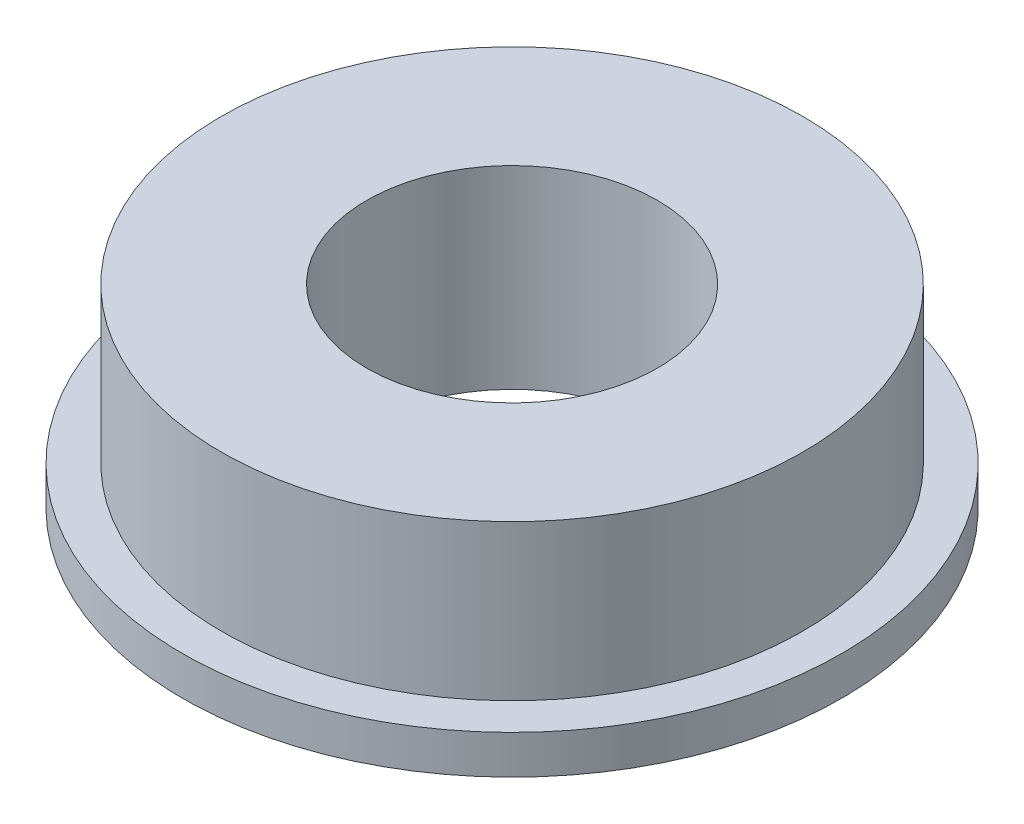
ISO-10303-21;
HEADER;
FILE_DESCRIPTION(('STEP AP214'),'2;1');
FILE_NAME('part.step','',(''),(''),'','','');
FILE_SCHEMA(('AUTOMOTIVE_DESIGN { 1 0 10303 214 1 1 1 1 }'));
ENDSEC;
DATA;
#1=APPLICATION_CONTEXT('core data for automotive mechanical design processes');
#2=APPLICATION_PROTOCOL_DEFINITION('international standard','automotive_design',2000,#1);
#3=PRODUCT_CONTEXT('',#1,'mechanical');
#4=PRODUCT('Part','Part','',(#3));
#5=PRODUCT_RELATED_PRODUCT_CATEGORY('part','',(#4));
#6=PRODUCT_DEFINITION_FORMATION('','',#4);
#7=PRODUCT_DEFINITION_CONTEXT('part definition',#1,'design');
#8=PRODUCT_DEFINITION('design','',#6,#7);
#9=PRODUCT_DEFINITION_SHAPE('','',#8);
#10=(LENGTH_UNIT() NAMED_UNIT(*) SI_UNIT(.MILLI.,.METRE.));
#11=(NAMED_UNIT(*) PLANE_ANGLE_UNIT() SI_UNIT($,.RADIAN.));
#12=(NAMED_UNIT(*) SI_UNIT($,.STERADIAN.) SOLID_ANGLE_UNIT());
#13=UNCERTAINTY_MEASURE_WITH_UNIT(LENGTH_MEASURE(1.E-05),#10,'distance_accuracy_value','');
#14=(GEOMETRIC_REPRESENTATION_CONTEXT(3) GLOBAL_UNCERTAINTY_ASSIGNED_CONTEXT((#13)) GLOBAL_UNIT_ASSIGNED_CONTEXT((#10,
#11,#12)) REPRESENTATION_CONTEXT('',''));
#15=CARTESIAN_POINT('',(0.,0.,0.));
#16=DIRECTION('',(0.,0.,1.));
#17=DIRECTION('',(1.,0.,0.));
#18=AXIS2_PLACEMENT_3D('',#15,#16,#17);
#19=CARTESIAN_POINT('',(0.,0.,0.));
#20=DIRECTION('',(0.,-1.,0.));
#21=DIRECTION('',(0.,0.,-1.));
#22=AXIS2_PLACEMENT_3D('',#19,#20,#21);
#23=CYLINDRICAL_SURFACE('',#22,3.);
#24=CARTESIAN_POINT('',(0.,0.,0.));
#25=DIRECTION('',(0.,-1.,0.));
#26=DIRECTION('',(0.,0.,-1.));
#27=AXIS2_PLACEMENT_3D('',#24,#25,#26);
#28=CIRCLE('',#27,3.);
#29=CARTESIAN_POINT('',(0.,0.,-3.));
#30=VERTEX_POINT('',#29);
#31=EDGE_CURVE('E58',#30,#30,#28,.T.);
#32=ORIENTED_EDGE('',*,*,#31,.T.);
#33=EDGE_LOOP('',(#32));
#34=FACE_BOUND('',#33,.T.);
#35=CARTESIAN_POINT('',(0.,4.,0.));
#36=DIRECTION('',(0.,-1.,0.));
#37=DIRECTION('',(0.,0.,-1.));
#38=AXIS2_PLACEMENT_3D('',#35,#36,#37);
#39=CIRCLE('',#38,3.);
#40=CARTESIAN_POINT('',(0.,4.,-3.));
#41=VERTEX_POINT('',#40);
#42=EDGE_CURVE('E10',#41,#41,#39,.T.);
#43=ORIENTED_EDGE('',*,*,#42,.F.);
#44=EDGE_LOOP('',(#43));
#45=FACE_BOUND('',#44,.T.);
#46=ADVANCED_FACE('F36',(#34,#45),#23,.F.);
#47=CARTESIAN_POINT('',(0.,4.,0.));
#48=DIRECTION('',(0.,1.,0.));
#49=DIRECTION('',(0.,0.,1.));
#50=AXIS2_PLACEMENT_3D('',#47,#48,#49);
#51=PLANE('',#50);
#52=ORIENTED_EDGE('',*,*,#42,.T.);
#53=EDGE_LOOP('',(#52));
#54=FACE_BOUND('',#53,.T.);
#55=CARTESIAN_POINT('',(0.,4.,0.));
#56=DIRECTION('',(0.,-1.,0.));
#57=DIRECTION('',(0.,0.,-1.));
#58=AXIS2_PLACEMENT_3D('',#55,#56,#57);
#59=CIRCLE('',#58,6.);
#60=CARTESIAN_POINT('',(0.,4.,-6.));
#61=VERTEX_POINT('',#60);
#62=EDGE_CURVE('E42',#61,#61,#59,.T.);
#63=ORIENTED_EDGE('',*,*,#62,.F.);
#64=EDGE_LOOP('',(#63));
#65=FACE_BOUND('',#64,.T.);
#66=ADVANCED_FACE('F76',(#54,#65),#51,.T.);
#67=CARTESIAN_POINT('',(0.,0.,0.));
#68=DIRECTION('',(0.,-1.,0.));
#69=DIRECTION('',(0.,0.,-1.));
#70=AXIS2_PLACEMENT_3D('',#67,#68,#69);
#71=CYLINDRICAL_SURFACE('',#70,6.);
#72=ORIENTED_EDGE('',*,*,#62,.T.);
#73=EDGE_LOOP('',(#72));
#74=FACE_BOUND('',#73,.T.);
#75=CARTESIAN_POINT('',(0.,0.8,0.));
#76=DIRECTION('',(0.,-1.,0.));
#77=DIRECTION('',(0.,0.,-1.));
#78=AXIS2_PLACEMENT_3D('',#75,#76,#77);
#79=CIRCLE('',#78,6.);
#80=CARTESIAN_POINT('',(0.,0.8,-6.));
#81=VERTEX_POINT('',#80);
#82=EDGE_CURVE('E46',#81,#81,#79,.T.);
#83=ORIENTED_EDGE('',*,*,#82,.F.);
#84=EDGE_LOOP('',(#83));
#85=FACE_BOUND('',#84,.T.);
#86=ADVANCED_FACE('F80',(#74,#85),#71,.T.);
#87=CARTESIAN_POINT('',(0.,0.8,0.));
#88=DIRECTION('',(0.,1.,0.));
#89=DIRECTION('',(0.,0.,1.));
#90=AXIS2_PLACEMENT_3D('',#87,#88,#89);
#91=PLANE('',#90);
#92=ORIENTED_EDGE('',*,*,#82,.T.);
#93=EDGE_LOOP('',(#92));
#94=FACE_BOUND('',#93,.T.);
#95=CARTESIAN_POINT('',(0.,0.8,0.));
#96=DIRECTION('',(0.,-1.,0.));
#97=DIRECTION('',(0.,0.,-1.));
#98=AXIS2_PLACEMENT_3D('',#95,#96,#97);
#99=CIRCLE('',#98,6.8);
#100=CARTESIAN_POINT('',(0.,0.8,-6.8));
#101=VERTEX_POINT('',#100);
#102=EDGE_CURVE('E50',#101,#101,#99,.T.);
#103=ORIENTED_EDGE('',*,*,#102,.F.);
#104=EDGE_LOOP('',(#103));
#105=FACE_BOUND('',#104,.T.);
#106=ADVANCED_FACE('F72',(#94,#105),#91,.T.);
#107=CARTESIAN_POINT('',(0.,0.,0.));
#108=DIRECTION('',(0.,-1.,0.));
#109=DIRECTION('',(0.,0.,-1.));
#110=AXIS2_PLACEMENT_3D('',#107,#108,#109);
#111=CYLINDRICAL_SURFACE('',#110,6.8);
#112=ORIENTED_EDGE('',*,*,#102,.T.);
#113=EDGE_LOOP('',(#112));
#114=FACE_BOUND('',#113,.T.);
#115=CARTESIAN_POINT('',(0.,0.,0.));
#116=DIRECTION('',(0.,-1.,0.));
#117=DIRECTION('',(0.,0.,-1.));
#118=AXIS2_PLACEMENT_3D('',#115,#116,#117);
#119=CIRCLE('',#118,6.8);
#120=CARTESIAN_POINT('',(0.,0.,-6.8));
#121=VERTEX_POINT('',#120);
#122=EDGE_CURVE('E55',#121,#121,#119,.T.);
#123=ORIENTED_EDGE('',*,*,#122,.F.);
#124=EDGE_LOOP('',(#123));
#125=FACE_BOUND('',#124,.T.);
#126=ADVANCED_FACE('F66',(#114,#125),#111,.T.);
#127=CARTESIAN_POINT('',(0.,0.,0.));
#128=DIRECTION('',(0.,-1.,0.));
#129=DIRECTION('',(0.,0.,-1.));
#130=AXIS2_PLACEMENT_3D('',#127,#128,#129);
#131=PLANE('',#130);
#132=ORIENTED_EDGE('',*,*,#122,.T.);
#133=EDGE_LOOP('',(#132));
#134=FACE_BOUND('',#133,.T.);
#135=ORIENTED_EDGE('',*,*,#31,.F.);
#136=EDGE_LOOP('',(#135));
#137=FACE_BOUND('',#136,.T.);
#138=ADVANCED_FACE('F64',(#134,#137),#131,.T.);
#139=CLOSED_SHELL('',(#46,#66,#86,#106,#126,#138));
#140=MANIFOLD_SOLID_BREP('B2',#139);
#141=ADVANCED_BREP_SHAPE_REPRESENTATION('',(#18,#140),#14);
#142=SHAPE_DEFINITION_REPRESENTATION(#9,#141);
ENDSEC;
END-ISO-10303-21;
